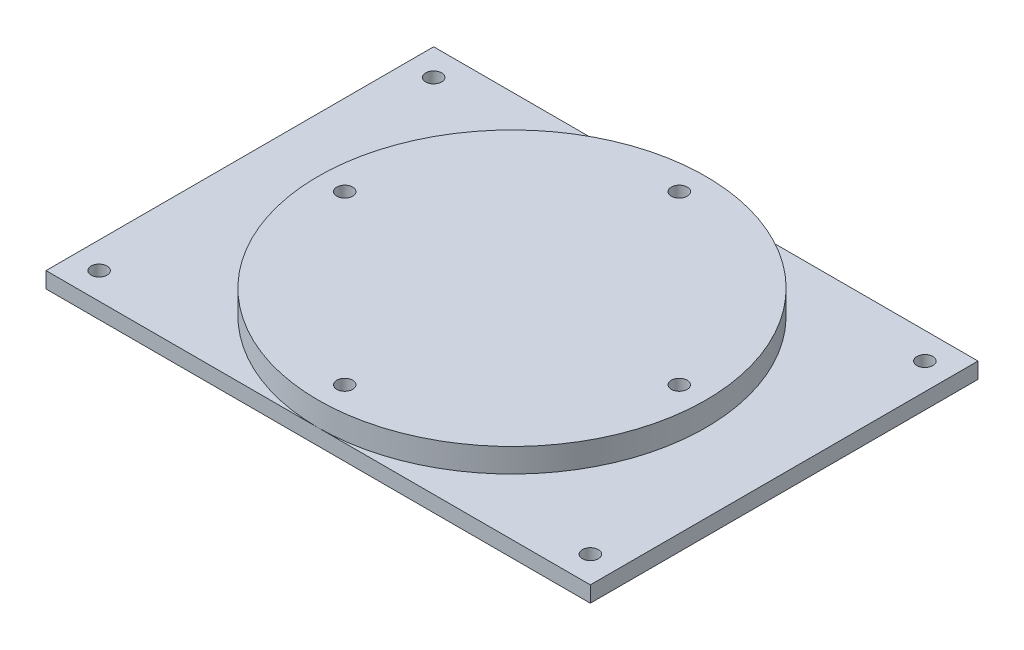
ISO-10303-21;
HEADER;
FILE_DESCRIPTION(('STEP AP214'),'2;1');
FILE_NAME('part.step','',(''),(''),'','','');
FILE_SCHEMA(('AUTOMOTIVE_DESIGN { 1 0 10303 214 1 1 1 1 }'));
ENDSEC;
DATA;
#1=APPLICATION_CONTEXT('core data for automotive mechanical design processes');
#2=APPLICATION_PROTOCOL_DEFINITION('international standard','automotive_design',2000,#1);
#3=PRODUCT_CONTEXT('',#1,'mechanical');
#4=PRODUCT('Part','Part','',(#3));
#5=PRODUCT_RELATED_PRODUCT_CATEGORY('part','',(#4));
#6=PRODUCT_DEFINITION_FORMATION('','',#4);
#7=PRODUCT_DEFINITION_CONTEXT('part definition',#1,'design');
#8=PRODUCT_DEFINITION('design','',#6,#7);
#9=PRODUCT_DEFINITION_SHAPE('','',#8);
#10=(LENGTH_UNIT() NAMED_UNIT(*) SI_UNIT(.MILLI.,.METRE.));
#11=(NAMED_UNIT(*) PLANE_ANGLE_UNIT() SI_UNIT($,.RADIAN.));
#12=(NAMED_UNIT(*) SI_UNIT($,.STERADIAN.) SOLID_ANGLE_UNIT());
#13=UNCERTAINTY_MEASURE_WITH_UNIT(LENGTH_MEASURE(1.E-05),#10,'distance_accuracy_value','');
#14=(GEOMETRIC_REPRESENTATION_CONTEXT(3) GLOBAL_UNCERTAINTY_ASSIGNED_CONTEXT((#13)) GLOBAL_UNIT_ASSIGNED_CONTEXT((#10,
#11,#12)) REPRESENTATION_CONTEXT('',''));
#15=CARTESIAN_POINT('',(0.,0.,0.));
#16=DIRECTION('',(0.,0.,1.));
#17=DIRECTION('',(1.,0.,0.));
#18=AXIS2_PLACEMENT_3D('',#15,#16,#17);
#19=CARTESIAN_POINT('',(0.,3.,-36.5));
#20=DIRECTION('',(0.,0.,-1.));
#21=DIRECTION('',(-1.,0.,0.));
#22=AXIS2_PLACEMENT_3D('',#19,#20,#21);
#23=PLANE('',#22);
#24=DIRECTION('',(1.,0.,0.));
#25=VECTOR('',#24,1.);
#26=CARTESIAN_POINT('',(0.,0.,-36.5));
#27=LINE('',#26,#25);
#28=CARTESIAN_POINT('',(-51.25,0.,-36.5));
#29=VERTEX_POINT('',#28);
#30=CARTESIAN_POINT('',(51.25,0.,-36.5));
#31=VERTEX_POINT('',#30);
#32=EDGE_CURVE('E115',#29,#31,#27,.T.);
#33=ORIENTED_EDGE('',*,*,#32,.F.);
#34=DIRECTION('',(0.,-1.,0.));
#35=VECTOR('',#34,1.);
#36=CARTESIAN_POINT('',(-51.25,3.,-36.5));
#37=LINE('',#36,#35);
#38=CARTESIAN_POINT('',(-51.25,3.,-36.5));
#39=VERTEX_POINT('',#38);
#40=EDGE_CURVE('E110',#39,#29,#37,.T.);
#41=ORIENTED_EDGE('',*,*,#40,.F.);
#42=DIRECTION('',(1.,0.,0.));
#43=VECTOR('',#42,1.);
#44=CARTESIAN_POINT('',(0.,3.,-36.5));
#45=LINE('',#44,#43);
#46=CARTESIAN_POINT('',(0.,3.,-36.5));
#47=VERTEX_POINT('',#46);
#48=EDGE_CURVE('E113',#39,#47,#45,.T.);
#49=ORIENTED_EDGE('',*,*,#48,.T.);
#50=DIRECTION('',(1.,0.,0.));
#51=VECTOR('',#50,1.);
#52=CARTESIAN_POINT('',(0.,3.,-36.5));
#53=LINE('',#52,#51);
#54=CARTESIAN_POINT('',(51.25,3.,-36.5));
#55=VERTEX_POINT('',#54);
#56=EDGE_CURVE('E171',#47,#55,#53,.T.);
#57=ORIENTED_EDGE('',*,*,#56,.T.);
#58=DIRECTION('',(0.,-1.,0.));
#59=VECTOR('',#58,1.);
#60=CARTESIAN_POINT('',(51.25,3.,-36.5));
#61=LINE('',#60,#59);
#62=EDGE_CURVE('E71',#55,#31,#61,.T.);
#63=ORIENTED_EDGE('',*,*,#62,.T.);
#64=EDGE_LOOP('',(#33,#41,#49,#57,#63));
#65=FACE_BOUND('',#64,.T.);
#66=ADVANCED_FACE('F62',(#65),#23,.T.);
#67=CARTESIAN_POINT('',(0.,3.,36.5));
#68=DIRECTION('',(0.,0.,-1.));
#69=DIRECTION('',(-1.,0.,0.));
#70=AXIS2_PLACEMENT_3D('',#67,#68,#69);
#71=PLANE('',#70);
#72=DIRECTION('',(1.,0.,0.));
#73=VECTOR('',#72,1.);
#74=CARTESIAN_POINT('',(0.,0.,36.5));
#75=LINE('',#74,#73);
#76=CARTESIAN_POINT('',(-51.25,0.,36.5));
#77=VERTEX_POINT('',#76);
#78=CARTESIAN_POINT('',(51.25,0.,36.5));
#79=VERTEX_POINT('',#78);
#80=EDGE_CURVE('E186',#77,#79,#75,.T.);
#81=ORIENTED_EDGE('',*,*,#80,.T.);
#82=DIRECTION('',(0.,-1.,0.));
#83=VECTOR('',#82,1.);
#84=CARTESIAN_POINT('',(51.25,3.,36.5));
#85=LINE('',#84,#83);
#86=CARTESIAN_POINT('',(51.25,3.,36.5));
#87=VERTEX_POINT('',#86);
#88=EDGE_CURVE('E12',#87,#79,#85,.T.);
#89=ORIENTED_EDGE('',*,*,#88,.F.);
#90=DIRECTION('',(1.,0.,0.));
#91=VECTOR('',#90,1.);
#92=CARTESIAN_POINT('',(0.,3.,36.5));
#93=LINE('',#92,#91);
#94=CARTESIAN_POINT('',(0.,3.,36.5));
#95=VERTEX_POINT('',#94);
#96=EDGE_CURVE('E176',#95,#87,#93,.T.);
#97=ORIENTED_EDGE('',*,*,#96,.F.);
#98=DIRECTION('',(1.,0.,0.));
#99=VECTOR('',#98,1.);
#100=CARTESIAN_POINT('',(0.,3.,36.5));
#101=LINE('',#100,#99);
#102=CARTESIAN_POINT('',(-51.25,3.,36.5));
#103=VERTEX_POINT('',#102);
#104=EDGE_CURVE('E134',#103,#95,#101,.T.);
#105=ORIENTED_EDGE('',*,*,#104,.F.);
#106=DIRECTION('',(0.,-1.,0.));
#107=VECTOR('',#106,1.);
#108=CARTESIAN_POINT('',(-51.25,3.,36.5));
#109=LINE('',#108,#107);
#110=EDGE_CURVE('E120',#103,#77,#109,.T.);
#111=ORIENTED_EDGE('',*,*,#110,.T.);
#112=EDGE_LOOP('',(#81,#89,#97,#105,#111));
#113=FACE_BOUND('',#112,.T.);
#114=ADVANCED_FACE('F199',(#113),#71,.F.);
#115=CARTESIAN_POINT('',(51.25,3.,0.));
#116=DIRECTION('',(1.,0.,0.));
#117=DIRECTION('',(0.,0.,-1.));
#118=AXIS2_PLACEMENT_3D('',#115,#116,#117);
#119=PLANE('',#118);
#120=DIRECTION('',(0.,0.,1.));
#121=VECTOR('',#120,1.);
#122=CARTESIAN_POINT('',(51.25,0.,0.));
#123=LINE('',#122,#121);
#124=EDGE_CURVE('E188',#31,#79,#123,.T.);
#125=ORIENTED_EDGE('',*,*,#124,.F.);
#126=ORIENTED_EDGE('',*,*,#62,.F.);
#127=DIRECTION('',(0.,0.,1.));
#128=VECTOR('',#127,1.);
#129=CARTESIAN_POINT('',(51.25,3.,0.));
#130=LINE('',#129,#128);
#131=EDGE_CURVE('E178',#55,#87,#130,.T.);
#132=ORIENTED_EDGE('',*,*,#131,.T.);
#133=ORIENTED_EDGE('',*,*,#88,.T.);
#134=EDGE_LOOP('',(#125,#126,#132,#133));
#135=FACE_BOUND('',#134,.T.);
#136=ADVANCED_FACE('F197',(#135),#119,.T.);
#137=CARTESIAN_POINT('',(46.25,3.,-31.5));
#138=DIRECTION('',(0.,-1.,0.));
#139=DIRECTION('',(0.,0.,-1.));
#140=AXIS2_PLACEMENT_3D('',#137,#138,#139);
#141=CYLINDRICAL_SURFACE('',#140,1.5);
#142=CARTESIAN_POINT('',(46.25,3.,-31.5));
#143=DIRECTION('',(0.,1.,0.));
#144=DIRECTION('',(0.,0.,1.));
#145=AXIS2_PLACEMENT_3D('',#142,#143,#144);
#146=CIRCLE('',#145,1.5);
#147=CARTESIAN_POINT('',(46.25,3.,-30.));
#148=VERTEX_POINT('',#147);
#149=EDGE_CURVE('E168',#148,#148,#146,.T.);
#150=ORIENTED_EDGE('',*,*,#149,.T.);
#151=EDGE_LOOP('',(#150));
#152=FACE_BOUND('',#151,.T.);
#153=CARTESIAN_POINT('',(46.25,0.,-31.5));
#154=DIRECTION('',(0.,1.,0.));
#155=DIRECTION('',(0.,0.,1.));
#156=AXIS2_PLACEMENT_3D('',#153,#154,#155);
#157=CIRCLE('',#156,1.5);
#158=CARTESIAN_POINT('',(46.25,0.,-30.));
#159=VERTEX_POINT('',#158);
#160=EDGE_CURVE('E167',#159,#159,#157,.T.);
#161=ORIENTED_EDGE('',*,*,#160,.F.);
#162=EDGE_LOOP('',(#161));
#163=FACE_BOUND('',#162,.T.);
#164=ADVANCED_FACE('F64',(#152,#163),#141,.F.);
#165=CARTESIAN_POINT('',(46.25,3.,31.5));
#166=DIRECTION('',(0.,-1.,0.));
#167=DIRECTION('',(0.,0.,-1.));
#168=AXIS2_PLACEMENT_3D('',#165,#166,#167);
#169=CYLINDRICAL_SURFACE('',#168,1.5);
#170=CARTESIAN_POINT('',(46.25,3.,31.5));
#171=DIRECTION('',(0.,1.,0.));
#172=DIRECTION('',(0.,0.,1.));
#173=AXIS2_PLACEMENT_3D('',#170,#171,#172);
#174=CIRCLE('',#173,1.5);
#175=CARTESIAN_POINT('',(46.25,3.,33.));
#176=VERTEX_POINT('',#175);
#177=EDGE_CURVE('E180',#176,#176,#174,.T.);
#178=ORIENTED_EDGE('',*,*,#177,.T.);
#179=EDGE_LOOP('',(#178));
#180=FACE_BOUND('',#179,.T.);
#181=CARTESIAN_POINT('',(46.25,0.,31.5));
#182=DIRECTION('',(0.,1.,0.));
#183=DIRECTION('',(0.,0.,1.));
#184=AXIS2_PLACEMENT_3D('',#181,#182,#183);
#185=CIRCLE('',#184,1.5);
#186=CARTESIAN_POINT('',(46.25,0.,33.));
#187=VERTEX_POINT('',#186);
#188=EDGE_CURVE('E172',#187,#187,#185,.T.);
#189=ORIENTED_EDGE('',*,*,#188,.F.);
#190=EDGE_LOOP('',(#189));
#191=FACE_BOUND('',#190,.T.);
#192=ADVANCED_FACE('F205',(#180,#191),#169,.F.);
#193=CARTESIAN_POINT('',(0.,3.,0.));
#194=DIRECTION('',(0.,1.,0.));
#195=DIRECTION('',(0.,0.,1.));
#196=AXIS2_PLACEMENT_3D('',#193,#194,#195);
#197=PLANE('',#196);
#198=ORIENTED_EDGE('',*,*,#149,.F.);
#199=EDGE_LOOP('',(#198));
#200=FACE_BOUND('',#199,.T.);
#201=ORIENTED_EDGE('',*,*,#56,.F.);
#202=CARTESIAN_POINT('',(0.,3.,0.));
#203=DIRECTION('',(0.,1.,0.));
#204=DIRECTION('',(0.,0.,1.));
#205=AXIS2_PLACEMENT_3D('',#202,#203,#204);
#206=CIRCLE('',#205,36.5);
#207=EDGE_CURVE('E174',#95,#47,#206,.T.);
#208=ORIENTED_EDGE('',*,*,#207,.F.);
#209=ORIENTED_EDGE('',*,*,#96,.T.);
#210=ORIENTED_EDGE('',*,*,#131,.F.);
#211=EDGE_LOOP('',(#201,#208,#209,#210));
#212=FACE_BOUND('',#211,.T.);
#213=ORIENTED_EDGE('',*,*,#177,.F.);
#214=EDGE_LOOP('',(#213));
#215=FACE_BOUND('',#214,.T.);
#216=ADVANCED_FACE('F225',(#200,#212,#215),#197,.T.);
#217=CARTESIAN_POINT('',(0.,0.,0.));
#218=DIRECTION('',(0.,1.,0.));
#219=DIRECTION('',(0.,0.,1.));
#220=AXIS2_PLACEMENT_3D('',#217,#218,#219);
#221=PLANE('',#220);
#222=CARTESIAN_POINT('',(0.,0.,-31.5));
#223=DIRECTION('',(0.,1.,0.));
#224=DIRECTION('',(0.,0.,1.));
#225=AXIS2_PLACEMENT_3D('',#222,#223,#224);
#226=CIRCLE('',#225,3.25);
#227=CARTESIAN_POINT('',(0.,0.,-28.25));
#228=VERTEX_POINT('',#227);
#229=EDGE_CURVE('E664',#228,#228,#226,.T.);
#230=ORIENTED_EDGE('',*,*,#229,.T.);
#231=EDGE_LOOP('',(#230));
#232=FACE_BOUND('',#231,.T.);
#233=CARTESIAN_POINT('',(-31.5,0.,0.));
#234=DIRECTION('',(0.,1.,0.));
#235=DIRECTION('',(0.,0.,1.));
#236=AXIS2_PLACEMENT_3D('',#233,#234,#235);
#237=CIRCLE('',#236,3.25);
#238=CARTESIAN_POINT('',(-31.5,0.,3.25000000000001));
#239=VERTEX_POINT('',#238);
#240=EDGE_CURVE('E655',#239,#239,#237,.T.);
#241=ORIENTED_EDGE('',*,*,#240,.T.);
#242=EDGE_LOOP('',(#241));
#243=FACE_BOUND('',#242,.T.);
#244=CARTESIAN_POINT('',(0.,0.,31.5));
#245=DIRECTION('',(0.,1.,0.));
#246=DIRECTION('',(0.,0.,1.));
#247=AXIS2_PLACEMENT_3D('',#244,#245,#246);
#248=CIRCLE('',#247,3.25);
#249=CARTESIAN_POINT('',(0.,0.,34.75));
#250=VERTEX_POINT('',#249);
#251=EDGE_CURVE('E622',#250,#250,#248,.T.);
#252=ORIENTED_EDGE('',*,*,#251,.T.);
#253=EDGE_LOOP('',(#252));
#254=FACE_BOUND('',#253,.T.);
#255=CARTESIAN_POINT('',(31.5,0.,0.));
#256=DIRECTION('',(0.,1.,0.));
#257=DIRECTION('',(0.,0.,1.));
#258=AXIS2_PLACEMENT_3D('',#255,#256,#257);
#259=CIRCLE('',#258,3.25);
#260=CARTESIAN_POINT('',(31.5,0.,3.25000000000001));
#261=VERTEX_POINT('',#260);
#262=EDGE_CURVE('E627',#261,#261,#259,.T.);
#263=ORIENTED_EDGE('',*,*,#262,.T.);
#264=EDGE_LOOP('',(#263));
#265=FACE_BOUND('',#264,.T.);
#266=ORIENTED_EDGE('',*,*,#160,.T.);
#267=EDGE_LOOP('',(#266));
#268=FACE_BOUND('',#267,.T.);
#269=ORIENTED_EDGE('',*,*,#32,.T.);
#270=ORIENTED_EDGE('',*,*,#124,.T.);
#271=ORIENTED_EDGE('',*,*,#80,.F.);
#272=DIRECTION('',(0.,0.,1.));
#273=VECTOR('',#272,1.);
#274=CARTESIAN_POINT('',(-51.25,0.,0.));
#275=LINE('',#274,#273);
#276=EDGE_CURVE('E143',#29,#77,#275,.T.);
#277=ORIENTED_EDGE('',*,*,#276,.F.);
#278=EDGE_LOOP('',(#269,#270,#271,#277));
#279=FACE_BOUND('',#278,.T.);
#280=ORIENTED_EDGE('',*,*,#188,.T.);
#281=EDGE_LOOP('',(#280));
#282=FACE_BOUND('',#281,.T.);
#283=CARTESIAN_POINT('',(-46.25,0.,-31.5));
#284=DIRECTION('',(0.,1.,0.));
#285=DIRECTION('',(0.,0.,1.));
#286=AXIS2_PLACEMENT_3D('',#283,#284,#285);
#287=CIRCLE('',#286,1.5);
#288=CARTESIAN_POINT('',(-46.25,0.,-30.));
#289=VERTEX_POINT('',#288);
#290=EDGE_CURVE('E145',#289,#289,#287,.T.);
#291=ORIENTED_EDGE('',*,*,#290,.T.);
#292=EDGE_LOOP('',(#291));
#293=FACE_BOUND('',#292,.T.);
#294=CARTESIAN_POINT('',(-46.25,0.,31.5));
#295=DIRECTION('',(0.,1.,0.));
#296=DIRECTION('',(0.,0.,1.));
#297=AXIS2_PLACEMENT_3D('',#294,#295,#296);
#298=CIRCLE('',#297,1.5);
#299=CARTESIAN_POINT('',(-46.25,0.,33.));
#300=VERTEX_POINT('',#299);
#301=EDGE_CURVE('E149',#300,#300,#298,.T.);
#302=ORIENTED_EDGE('',*,*,#301,.T.);
#303=EDGE_LOOP('',(#302));
#304=FACE_BOUND('',#303,.T.);
#305=ADVANCED_FACE('F195',(#232,#243,#254,#265,#268,#279,#282,#293,#304),#221,.F.);
#306=CARTESIAN_POINT('',(31.5,7.5,0.));
#307=DIRECTION('',(0.,-1.,0.));
#308=DIRECTION('',(0.,0.,-1.));
#309=AXIS2_PLACEMENT_3D('',#306,#307,#308);
#310=CYLINDRICAL_SURFACE('',#309,1.5);
#311=CARTESIAN_POINT('',(31.5,2.5,0.));
#312=DIRECTION('',(0.,1.,0.));
#313=DIRECTION('',(0.,0.,1.));
#314=AXIS2_PLACEMENT_3D('',#311,#312,#313);
#315=CIRCLE('',#314,1.5);
#316=CARTESIAN_POINT('',(31.5,2.5,1.50000000000001));
#317=VERTEX_POINT('',#316);
#318=EDGE_CURVE('E618',#317,#317,#315,.T.);
#319=ORIENTED_EDGE('',*,*,#318,.F.);
#320=EDGE_LOOP('',(#319));
#321=FACE_BOUND('',#320,.T.);
#322=CARTESIAN_POINT('',(31.5,7.5,0.));
#323=DIRECTION('',(0.,1.,0.));
#324=DIRECTION('',(0.,0.,1.));
#325=AXIS2_PLACEMENT_3D('',#322,#323,#324);
#326=CIRCLE('',#325,1.5);
#327=CARTESIAN_POINT('',(31.5,7.5,1.50000000000001));
#328=VERTEX_POINT('',#327);
#329=EDGE_CURVE('E161',#328,#328,#326,.T.);
#330=ORIENTED_EDGE('',*,*,#329,.T.);
#331=EDGE_LOOP('',(#330));
#332=FACE_BOUND('',#331,.T.);
#333=ADVANCED_FACE('F311',(#321,#332),#310,.F.);
#334=CARTESIAN_POINT('',(-31.5,7.5,0.));
#335=DIRECTION('',(0.,-1.,0.));
#336=DIRECTION('',(0.,0.,-1.));
#337=AXIS2_PLACEMENT_3D('',#334,#335,#336);
#338=CYLINDRICAL_SURFACE('',#337,1.5);
#339=CARTESIAN_POINT('',(-31.5,2.5,0.));
#340=DIRECTION('',(0.,1.,0.));
#341=DIRECTION('',(0.,0.,1.));
#342=AXIS2_PLACEMENT_3D('',#339,#340,#341);
#343=CIRCLE('',#342,1.5);
#344=CARTESIAN_POINT('',(-31.5,2.5,1.50000000000001));
#345=VERTEX_POINT('',#344);
#346=EDGE_CURVE('E661',#345,#345,#343,.T.);
#347=ORIENTED_EDGE('',*,*,#346,.F.);
#348=EDGE_LOOP('',(#347));
#349=FACE_BOUND('',#348,.T.);
#350=CARTESIAN_POINT('',(-31.5,7.5,0.));
#351=DIRECTION('',(0.,1.,0.));
#352=DIRECTION('',(0.,0.,1.));
#353=AXIS2_PLACEMENT_3D('',#350,#351,#352);
#354=CIRCLE('',#353,1.5);
#355=CARTESIAN_POINT('',(-31.5,7.5,1.50000000000001));
#356=VERTEX_POINT('',#355);
#357=EDGE_CURVE('E158',#356,#356,#354,.T.);
#358=ORIENTED_EDGE('',*,*,#357,.T.);
#359=EDGE_LOOP('',(#358));
#360=FACE_BOUND('',#359,.T.);
#361=ADVANCED_FACE('F245',(#349,#360),#338,.F.);
#362=CARTESIAN_POINT('',(0.,7.5,0.));
#363=DIRECTION('',(0.,-1.,0.));
#364=DIRECTION('',(0.,0.,-1.));
#365=AXIS2_PLACEMENT_3D('',#362,#363,#364);
#366=CYLINDRICAL_SURFACE('',#365,36.5);
#367=ORIENTED_EDGE('',*,*,#207,.T.);
#368=CARTESIAN_POINT('',(0.,3.,0.));
#369=DIRECTION('',(0.,1.,0.));
#370=DIRECTION('',(0.,0.,1.));
#371=AXIS2_PLACEMENT_3D('',#368,#369,#370);
#372=CIRCLE('',#371,36.5);
#373=EDGE_CURVE('E92',#47,#95,#372,.T.);
#374=ORIENTED_EDGE('',*,*,#373,.T.);
#375=EDGE_LOOP('',(#367,#374));
#376=FACE_BOUND('',#375,.T.);
#377=CARTESIAN_POINT('',(0.,7.5,0.));
#378=DIRECTION('',(0.,1.,0.));
#379=DIRECTION('',(0.,0.,1.));
#380=AXIS2_PLACEMENT_3D('',#377,#378,#379);
#381=CIRCLE('',#380,36.5);
#382=CARTESIAN_POINT('',(0.,7.5,36.5));
#383=VERTEX_POINT('',#382);
#384=EDGE_CURVE('E155',#383,#383,#381,.T.);
#385=ORIENTED_EDGE('',*,*,#384,.F.);
#386=EDGE_LOOP('',(#385));
#387=FACE_BOUND('',#386,.T.);
#388=ADVANCED_FACE('F239',(#376,#387),#366,.T.);
#389=CARTESIAN_POINT('',(0.,7.5,-31.5));
#390=DIRECTION('',(0.,-1.,0.));
#391=DIRECTION('',(0.,0.,-1.));
#392=AXIS2_PLACEMENT_3D('',#389,#390,#391);
#393=CYLINDRICAL_SURFACE('',#392,1.5);
#394=CARTESIAN_POINT('',(0.,2.5,-31.5));
#395=DIRECTION('',(0.,1.,0.));
#396=DIRECTION('',(0.,0.,1.));
#397=AXIS2_PLACEMENT_3D('',#394,#395,#396);
#398=CIRCLE('',#397,1.5);
#399=CARTESIAN_POINT('',(0.,2.5,-30.));
#400=VERTEX_POINT('',#399);
#401=EDGE_CURVE('E669',#400,#400,#398,.T.);
#402=ORIENTED_EDGE('',*,*,#401,.F.);
#403=EDGE_LOOP('',(#402));
#404=FACE_BOUND('',#403,.T.);
#405=CARTESIAN_POINT('',(0.,7.5,-31.5));
#406=DIRECTION('',(0.,1.,0.));
#407=DIRECTION('',(0.,0.,1.));
#408=AXIS2_PLACEMENT_3D('',#405,#406,#407);
#409=CIRCLE('',#408,1.5);
#410=CARTESIAN_POINT('',(0.,7.5,-30.));
#411=VERTEX_POINT('',#410);
#412=EDGE_CURVE('E119',#411,#411,#409,.T.);
#413=ORIENTED_EDGE('',*,*,#412,.T.);
#414=EDGE_LOOP('',(#413));
#415=FACE_BOUND('',#414,.T.);
#416=ADVANCED_FACE('F244',(#404,#415),#393,.F.);
#417=CARTESIAN_POINT('',(0.,7.5,31.5));
#418=DIRECTION('',(0.,-1.,0.));
#419=DIRECTION('',(0.,0.,-1.));
#420=AXIS2_PLACEMENT_3D('',#417,#418,#419);
#421=CYLINDRICAL_SURFACE('',#420,1.5);
#422=CARTESIAN_POINT('',(0.,2.5,31.5));
#423=DIRECTION('',(0.,1.,0.));
#424=DIRECTION('',(0.,0.,1.));
#425=AXIS2_PLACEMENT_3D('',#422,#423,#424);
#426=CIRCLE('',#425,1.5);
#427=CARTESIAN_POINT('',(0.,2.5,33.));
#428=VERTEX_POINT('',#427);
#429=EDGE_CURVE('E652',#428,#428,#426,.T.);
#430=ORIENTED_EDGE('',*,*,#429,.F.);
#431=EDGE_LOOP('',(#430));
#432=FACE_BOUND('',#431,.T.);
#433=CARTESIAN_POINT('',(0.,7.5,31.5));
#434=DIRECTION('',(0.,1.,0.));
#435=DIRECTION('',(0.,0.,1.));
#436=AXIS2_PLACEMENT_3D('',#433,#434,#435);
#437=CIRCLE('',#436,1.5);
#438=CARTESIAN_POINT('',(0.,7.5,33.));
#439=VERTEX_POINT('',#438);
#440=EDGE_CURVE('E164',#439,#439,#437,.T.);
#441=ORIENTED_EDGE('',*,*,#440,.T.);
#442=EDGE_LOOP('',(#441));
#443=FACE_BOUND('',#442,.T.);
#444=ADVANCED_FACE('F260',(#432,#443),#421,.F.);
#445=CARTESIAN_POINT('',(0.,7.5,0.));
#446=DIRECTION('',(0.,1.,0.));
#447=DIRECTION('',(0.,0.,1.));
#448=AXIS2_PLACEMENT_3D('',#445,#446,#447);
#449=PLANE('',#448);
#450=ORIENTED_EDGE('',*,*,#412,.F.);
#451=EDGE_LOOP('',(#450));
#452=FACE_BOUND('',#451,.T.);
#453=ORIENTED_EDGE('',*,*,#384,.T.);
#454=EDGE_LOOP('',(#453));
#455=FACE_BOUND('',#454,.T.);
#456=ORIENTED_EDGE('',*,*,#357,.F.);
#457=EDGE_LOOP('',(#456));
#458=FACE_BOUND('',#457,.T.);
#459=ORIENTED_EDGE('',*,*,#329,.F.);
#460=EDGE_LOOP('',(#459));
#461=FACE_BOUND('',#460,.T.);
#462=ORIENTED_EDGE('',*,*,#440,.F.);
#463=EDGE_LOOP('',(#462));
#464=FACE_BOUND('',#463,.T.);
#465=ADVANCED_FACE('F254',(#452,#455,#458,#461,#464),#449,.T.);
#466=CARTESIAN_POINT('',(-46.25,3.,-31.5));
#467=DIRECTION('',(0.,-1.,0.));
#468=DIRECTION('',(0.,0.,-1.));
#469=AXIS2_PLACEMENT_3D('',#466,#467,#468);
#470=CYLINDRICAL_SURFACE('',#469,1.5);
#471=CARTESIAN_POINT('',(-46.25,3.,-31.5));
#472=DIRECTION('',(0.,1.,0.));
#473=DIRECTION('',(0.,0.,1.));
#474=AXIS2_PLACEMENT_3D('',#471,#472,#473);
#475=CIRCLE('',#474,1.5);
#476=CARTESIAN_POINT('',(-46.25,3.,-30.));
#477=VERTEX_POINT('',#476);
#478=EDGE_CURVE('E129',#477,#477,#475,.T.);
#479=ORIENTED_EDGE('',*,*,#478,.T.);
#480=EDGE_LOOP('',(#479));
#481=FACE_BOUND('',#480,.T.);
#482=ORIENTED_EDGE('',*,*,#290,.F.);
#483=EDGE_LOOP('',(#482));
#484=FACE_BOUND('',#483,.T.);
#485=ADVANCED_FACE('F259',(#481,#484),#470,.F.);
#486=CARTESIAN_POINT('',(-51.25,3.,0.));
#487=DIRECTION('',(1.,0.,0.));
#488=DIRECTION('',(0.,0.,-1.));
#489=AXIS2_PLACEMENT_3D('',#486,#487,#488);
#490=PLANE('',#489);
#491=ORIENTED_EDGE('',*,*,#276,.T.);
#492=ORIENTED_EDGE('',*,*,#110,.F.);
#493=DIRECTION('',(0.,0.,1.));
#494=VECTOR('',#493,1.);
#495=CARTESIAN_POINT('',(-51.25,3.,0.));
#496=LINE('',#495,#494);
#497=EDGE_CURVE('E123',#39,#103,#496,.T.);
#498=ORIENTED_EDGE('',*,*,#497,.F.);
#499=ORIENTED_EDGE('',*,*,#40,.T.);
#500=EDGE_LOOP('',(#491,#492,#498,#499));
#501=FACE_BOUND('',#500,.T.);
#502=ADVANCED_FACE('F124',(#501),#490,.F.);
#503=CARTESIAN_POINT('',(-46.25,3.,31.5));
#504=DIRECTION('',(0.,-1.,0.));
#505=DIRECTION('',(0.,0.,-1.));
#506=AXIS2_PLACEMENT_3D('',#503,#504,#505);
#507=CYLINDRICAL_SURFACE('',#506,1.5);
#508=CARTESIAN_POINT('',(-46.25,3.,31.5));
#509=DIRECTION('',(0.,1.,0.));
#510=DIRECTION('',(0.,0.,1.));
#511=AXIS2_PLACEMENT_3D('',#508,#509,#510);
#512=CIRCLE('',#511,1.5);
#513=CARTESIAN_POINT('',(-46.25,3.,33.));
#514=VERTEX_POINT('',#513);
#515=EDGE_CURVE('E140',#514,#514,#512,.T.);
#516=ORIENTED_EDGE('',*,*,#515,.T.);
#517=EDGE_LOOP('',(#516));
#518=FACE_BOUND('',#517,.T.);
#519=ORIENTED_EDGE('',*,*,#301,.F.);
#520=EDGE_LOOP('',(#519));
#521=FACE_BOUND('',#520,.T.);
#522=ADVANCED_FACE('F283',(#518,#521),#507,.F.);
#523=CARTESIAN_POINT('',(0.,3.,0.));
#524=DIRECTION('',(0.,1.,0.));
#525=DIRECTION('',(0.,0.,1.));
#526=AXIS2_PLACEMENT_3D('',#523,#524,#525);
#527=PLANE('',#526);
#528=ORIENTED_EDGE('',*,*,#104,.T.);
#529=ORIENTED_EDGE('',*,*,#373,.F.);
#530=ORIENTED_EDGE('',*,*,#48,.F.);
#531=ORIENTED_EDGE('',*,*,#497,.T.);
#532=EDGE_LOOP('',(#528,#529,#530,#531));
#533=FACE_BOUND('',#532,.T.);
#534=ORIENTED_EDGE('',*,*,#478,.F.);
#535=EDGE_LOOP('',(#534));
#536=FACE_BOUND('',#535,.T.);
#537=ORIENTED_EDGE('',*,*,#515,.F.);
#538=EDGE_LOOP('',(#537));
#539=FACE_BOUND('',#538,.T.);
#540=ADVANCED_FACE('F131',(#533,#536,#539),#527,.T.);
#541=CARTESIAN_POINT('',(0.,2.5,31.5));
#542=DIRECTION('',(0.,-1.,0.));
#543=DIRECTION('',(0.,0.,-1.));
#544=AXIS2_PLACEMENT_3D('',#541,#542,#543);
#545=CYLINDRICAL_SURFACE('',#544,3.25);
#546=CARTESIAN_POINT('',(0.,2.5,31.5));
#547=DIRECTION('',(0.,1.,0.));
#548=DIRECTION('',(0.,0.,1.));
#549=AXIS2_PLACEMENT_3D('',#546,#547,#548);
#550=CIRCLE('',#549,3.25);
#551=CARTESIAN_POINT('',(0.,2.5,34.75));
#552=VERTEX_POINT('',#551);
#553=EDGE_CURVE('E625',#552,#552,#550,.T.);
#554=ORIENTED_EDGE('',*,*,#553,.T.);
#555=EDGE_LOOP('',(#554));
#556=FACE_BOUND('',#555,.T.);
#557=ORIENTED_EDGE('',*,*,#251,.F.);
#558=EDGE_LOOP('',(#557));
#559=FACE_BOUND('',#558,.T.);
#560=ADVANCED_FACE('F301',(#556,#559),#545,.F.);
#561=CARTESIAN_POINT('',(0.,2.5,0.));
#562=DIRECTION('',(0.,1.,0.));
#563=DIRECTION('',(0.,0.,1.));
#564=AXIS2_PLACEMENT_3D('',#561,#562,#563);
#565=PLANE('',#564);
#566=ORIENTED_EDGE('',*,*,#553,.F.);
#567=EDGE_LOOP('',(#566));
#568=FACE_BOUND('',#567,.T.);
#569=ORIENTED_EDGE('',*,*,#429,.T.);
#570=EDGE_LOOP('',(#569));
#571=FACE_BOUND('',#570,.T.);
#572=ADVANCED_FACE('F352',(#568,#571),#565,.F.);
#573=CARTESIAN_POINT('',(0.,2.5,-31.5));
#574=DIRECTION('',(0.,-1.,0.));
#575=DIRECTION('',(0.,0.,-1.));
#576=AXIS2_PLACEMENT_3D('',#573,#574,#575);
#577=CYLINDRICAL_SURFACE('',#576,3.25);
#578=CARTESIAN_POINT('',(0.,2.5,-31.5));
#579=DIRECTION('',(0.,1.,0.));
#580=DIRECTION('',(0.,0.,1.));
#581=AXIS2_PLACEMENT_3D('',#578,#579,#580);
#582=CIRCLE('',#581,3.25);
#583=CARTESIAN_POINT('',(0.,2.5,-28.25));
#584=VERTEX_POINT('',#583);
#585=EDGE_CURVE('E146',#584,#584,#582,.T.);
#586=ORIENTED_EDGE('',*,*,#585,.T.);
#587=EDGE_LOOP('',(#586));
#588=FACE_BOUND('',#587,.T.);
#589=ORIENTED_EDGE('',*,*,#229,.F.);
#590=EDGE_LOOP('',(#589));
#591=FACE_BOUND('',#590,.T.);
#592=ADVANCED_FACE('F363',(#588,#591),#577,.F.);
#593=CARTESIAN_POINT('',(0.,2.5,0.));
#594=DIRECTION('',(0.,1.,0.));
#595=DIRECTION('',(0.,0.,1.));
#596=AXIS2_PLACEMENT_3D('',#593,#594,#595);
#597=PLANE('',#596);
#598=ORIENTED_EDGE('',*,*,#401,.T.);
#599=EDGE_LOOP('',(#598));
#600=FACE_BOUND('',#599,.T.);
#601=ORIENTED_EDGE('',*,*,#585,.F.);
#602=EDGE_LOOP('',(#601));
#603=FACE_BOUND('',#602,.T.);
#604=ADVANCED_FACE('F374',(#600,#603),#597,.F.);
#605=CARTESIAN_POINT('',(-31.5,2.5,0.));
#606=DIRECTION('',(0.,-1.,0.));
#607=DIRECTION('',(0.,0.,-1.));
#608=AXIS2_PLACEMENT_3D('',#605,#606,#607);
#609=CYLINDRICAL_SURFACE('',#608,3.25);
#610=CARTESIAN_POINT('',(-31.5,2.5,0.));
#611=DIRECTION('',(0.,1.,0.));
#612=DIRECTION('',(0.,0.,1.));
#613=AXIS2_PLACEMENT_3D('',#610,#611,#612);
#614=CIRCLE('',#613,3.25);
#615=CARTESIAN_POINT('',(-31.5,2.5,3.25000000000001));
#616=VERTEX_POINT('',#615);
#617=EDGE_CURVE('E660',#616,#616,#614,.T.);
#618=ORIENTED_EDGE('',*,*,#617,.T.);
#619=EDGE_LOOP('',(#618));
#620=FACE_BOUND('',#619,.T.);
#621=ORIENTED_EDGE('',*,*,#240,.F.);
#622=EDGE_LOOP('',(#621));
#623=FACE_BOUND('',#622,.T.);
#624=ADVANCED_FACE('F385',(#620,#623),#609,.F.);
#625=CARTESIAN_POINT('',(0.,2.5,0.));
#626=DIRECTION('',(0.,1.,0.));
#627=DIRECTION('',(0.,0.,1.));
#628=AXIS2_PLACEMENT_3D('',#625,#626,#627);
#629=PLANE('',#628);
#630=ORIENTED_EDGE('',*,*,#617,.F.);
#631=EDGE_LOOP('',(#630));
#632=FACE_BOUND('',#631,.T.);
#633=ORIENTED_EDGE('',*,*,#346,.T.);
#634=EDGE_LOOP('',(#633));
#635=FACE_BOUND('',#634,.T.);
#636=ADVANCED_FACE('F396',(#632,#635),#629,.F.);
#637=CARTESIAN_POINT('',(31.5,2.5,0.));
#638=DIRECTION('',(0.,-1.,0.));
#639=DIRECTION('',(0.,0.,-1.));
#640=AXIS2_PLACEMENT_3D('',#637,#638,#639);
#641=CYLINDRICAL_SURFACE('',#640,3.25);
#642=CARTESIAN_POINT('',(31.5,2.5,0.));
#643=DIRECTION('',(0.,1.,0.));
#644=DIRECTION('',(0.,0.,1.));
#645=AXIS2_PLACEMENT_3D('',#642,#643,#644);
#646=CIRCLE('',#645,3.25);
#647=CARTESIAN_POINT('',(31.5,2.5,3.25000000000001));
#648=VERTEX_POINT('',#647);
#649=EDGE_CURVE('E621',#648,#648,#646,.T.);
#650=ORIENTED_EDGE('',*,*,#649,.T.);
#651=EDGE_LOOP('',(#650));
#652=FACE_BOUND('',#651,.T.);
#653=ORIENTED_EDGE('',*,*,#262,.F.);
#654=EDGE_LOOP('',(#653));
#655=FACE_BOUND('',#654,.T.);
#656=ADVANCED_FACE('F407',(#652,#655),#641,.F.);
#657=CARTESIAN_POINT('',(0.,2.5,0.));
#658=DIRECTION('',(0.,1.,0.));
#659=DIRECTION('',(0.,0.,1.));
#660=AXIS2_PLACEMENT_3D('',#657,#658,#659);
#661=PLANE('',#660);
#662=ORIENTED_EDGE('',*,*,#318,.T.);
#663=EDGE_LOOP('',(#662));
#664=FACE_BOUND('',#663,.T.);
#665=ORIENTED_EDGE('',*,*,#649,.F.);
#666=EDGE_LOOP('',(#665));
#667=FACE_BOUND('',#666,.T.);
#668=ADVANCED_FACE('F418',(#664,#667),#661,.F.);
#669=CLOSED_SHELL('',(#66,#114,#136,#164,#192,#216,#305,#333,#361,#388,#416,#444,#465,#485,#502,
#522,#540,#560,#572,#592,#604,#624,#636,#656,#668));
#670=MANIFOLD_SOLID_BREP('B2',#669);
#671=ADVANCED_BREP_SHAPE_REPRESENTATION('',(#18,#670),#14);
#672=SHAPE_DEFINITION_REPRESENTATION(#9,#671);
ENDSEC;
END-ISO-10303-21;
